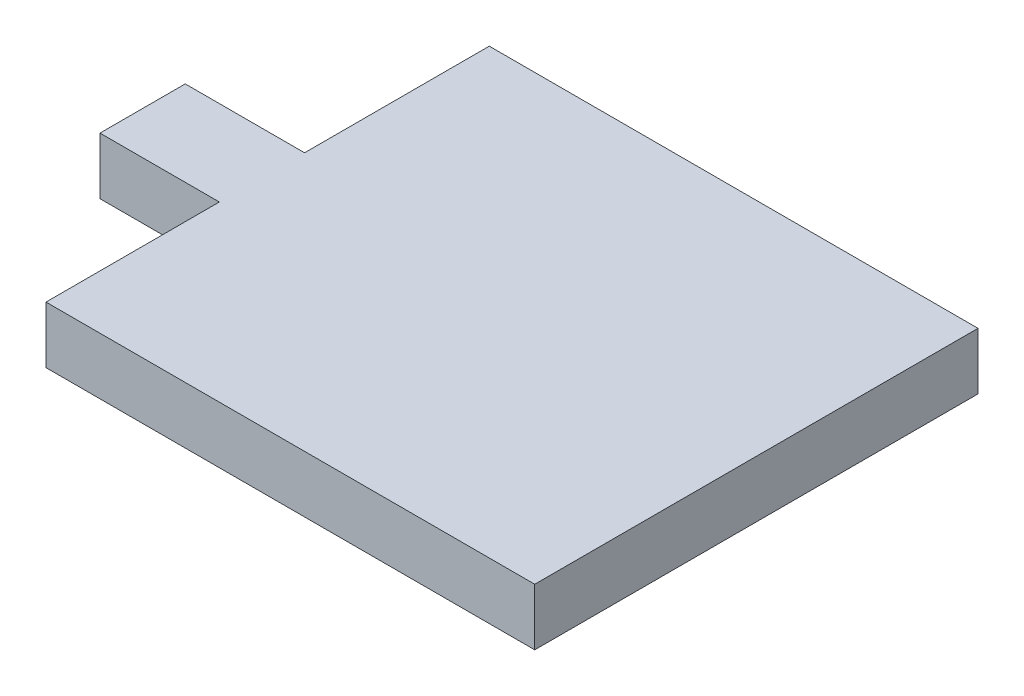
ISO-10303-21;
HEADER;
FILE_DESCRIPTION(('STEP AP214'),'2;1');
FILE_NAME('part.step','',(''),(''),'','','');
FILE_SCHEMA(('AUTOMOTIVE_DESIGN { 1 0 10303 214 1 1 1 1 }'));
ENDSEC;
DATA;
#1=APPLICATION_CONTEXT('core data for automotive mechanical design processes');
#2=APPLICATION_PROTOCOL_DEFINITION('international standard','automotive_design',2000,#1);
#3=PRODUCT_CONTEXT('',#1,'mechanical');
#4=PRODUCT('Part','Part','',(#3));
#5=PRODUCT_RELATED_PRODUCT_CATEGORY('part','',(#4));
#6=PRODUCT_DEFINITION_FORMATION('','',#4);
#7=PRODUCT_DEFINITION_CONTEXT('part definition',#1,'design');
#8=PRODUCT_DEFINITION('design','',#6,#7);
#9=PRODUCT_DEFINITION_SHAPE('','',#8);
#10=(LENGTH_UNIT() NAMED_UNIT(*) SI_UNIT(.MILLI.,.METRE.));
#11=(NAMED_UNIT(*) PLANE_ANGLE_UNIT() SI_UNIT($,.RADIAN.));
#12=(NAMED_UNIT(*) SI_UNIT($,.STERADIAN.) SOLID_ANGLE_UNIT());
#13=UNCERTAINTY_MEASURE_WITH_UNIT(LENGTH_MEASURE(1.E-05),#10,'distance_accuracy_value','');
#14=(GEOMETRIC_REPRESENTATION_CONTEXT(3) GLOBAL_UNCERTAINTY_ASSIGNED_CONTEXT((#13)) GLOBAL_UNIT_ASSIGNED_CONTEXT((#10,
#11,#12)) REPRESENTATION_CONTEXT('',''));
#15=CARTESIAN_POINT('',(0.,0.,0.));
#16=DIRECTION('',(0.,0.,1.));
#17=DIRECTION('',(1.,0.,0.));
#18=AXIS2_PLACEMENT_3D('',#15,#16,#17);
#19=CARTESIAN_POINT('',(0.,5.,0.));
#20=DIRECTION('',(1.,0.,0.));
#21=DIRECTION('',(0.,0.,-1.));
#22=AXIS2_PLACEMENT_3D('',#19,#20,#21);
#23=PLANE('',#22);
#24=DIRECTION('',(0.,0.,1.));
#25=VECTOR('',#24,1.);
#26=CARTESIAN_POINT('',(0.,0.,0.));
#27=LINE('',#26,#25);
#28=CARTESIAN_POINT('',(0.,0.,-15.25));
#29=VERTEX_POINT('',#28);
#30=CARTESIAN_POINT('',(0.,0.,0.));
#31=VERTEX_POINT('',#30);
#32=EDGE_CURVE('E158',#29,#31,#27,.T.);
#33=ORIENTED_EDGE('',*,*,#32,.T.);
#34=DIRECTION('',(0.,-1.,0.));
#35=VECTOR('',#34,1.);
#36=CARTESIAN_POINT('',(0.,5.,0.));
#37=LINE('',#36,#35);
#38=CARTESIAN_POINT('',(0.,5.,0.));
#39=VERTEX_POINT('',#38);
#40=EDGE_CURVE('E11',#39,#31,#37,.T.);
#41=ORIENTED_EDGE('',*,*,#40,.F.);
#42=DIRECTION('',(0.,0.,1.));
#43=VECTOR('',#42,1.);
#44=CARTESIAN_POINT('',(0.,5.,0.));
#45=LINE('',#44,#43);
#46=CARTESIAN_POINT('',(0.,5.,-15.25));
#47=VERTEX_POINT('',#46);
#48=EDGE_CURVE('E182',#47,#39,#45,.T.);
#49=ORIENTED_EDGE('',*,*,#48,.F.);
#50=DIRECTION('',(0.,-1.,0.));
#51=VECTOR('',#50,1.);
#52=CARTESIAN_POINT('',(0.,5.,-15.25));
#53=LINE('',#52,#51);
#54=EDGE_CURVE('E154',#47,#29,#53,.T.);
#55=ORIENTED_EDGE('',*,*,#54,.T.);
#56=EDGE_LOOP('',(#33,#41,#49,#55));
#57=FACE_BOUND('',#56,.T.);
#58=ADVANCED_FACE('F45',(#57),#23,.F.);
#59=CARTESIAN_POINT('',(0.,5.,0.));
#60=DIRECTION('',(0.,0.,-1.));
#61=DIRECTION('',(-1.,0.,0.));
#62=AXIS2_PLACEMENT_3D('',#59,#60,#61);
#63=PLANE('',#62);
#64=DIRECTION('',(1.,0.,0.));
#65=VECTOR('',#64,1.);
#66=CARTESIAN_POINT('',(0.,0.,0.));
#67=LINE('',#66,#65);
#68=CARTESIAN_POINT('',(43.,0.,0.));
#69=VERTEX_POINT('',#68);
#70=EDGE_CURVE('E162',#31,#69,#67,.T.);
#71=ORIENTED_EDGE('',*,*,#70,.T.);
#72=DIRECTION('',(0.,-1.,0.));
#73=VECTOR('',#72,1.);
#74=CARTESIAN_POINT('',(43.,5.,0.));
#75=LINE('',#74,#73);
#76=CARTESIAN_POINT('',(43.,5.,0.));
#77=VERTEX_POINT('',#76);
#78=EDGE_CURVE('E53',#77,#69,#75,.T.);
#79=ORIENTED_EDGE('',*,*,#78,.F.);
#80=DIRECTION('',(1.,0.,0.));
#81=VECTOR('',#80,1.);
#82=CARTESIAN_POINT('',(0.,5.,0.));
#83=LINE('',#82,#81);
#84=EDGE_CURVE('E110',#39,#77,#83,.T.);
#85=ORIENTED_EDGE('',*,*,#84,.F.);
#86=ORIENTED_EDGE('',*,*,#40,.T.);
#87=EDGE_LOOP('',(#71,#79,#85,#86));
#88=FACE_BOUND('',#87,.T.);
#89=ADVANCED_FACE('F308',(#88),#63,.F.);
#90=CARTESIAN_POINT('',(43.,5.,0.));
#91=DIRECTION('',(-1.,0.,0.));
#92=DIRECTION('',(0.,0.,1.));
#93=AXIS2_PLACEMENT_3D('',#90,#91,#92);
#94=PLANE('',#93);
#95=DIRECTION('',(0.,0.,-1.));
#96=VECTOR('',#95,1.);
#97=CARTESIAN_POINT('',(43.,0.,0.));
#98=LINE('',#97,#96);
#99=CARTESIAN_POINT('',(43.,0.,-39.));
#100=VERTEX_POINT('',#99);
#101=EDGE_CURVE('E166',#69,#100,#98,.T.);
#102=ORIENTED_EDGE('',*,*,#101,.T.);
#103=DIRECTION('',(0.,-1.,0.));
#104=VECTOR('',#103,1.);
#105=CARTESIAN_POINT('',(43.,5.,-39.));
#106=LINE('',#105,#104);
#107=CARTESIAN_POINT('',(43.,5.,-39.));
#108=VERTEX_POINT('',#107);
#109=EDGE_CURVE('E193',#108,#100,#106,.T.);
#110=ORIENTED_EDGE('',*,*,#109,.F.);
#111=DIRECTION('',(0.,0.,-1.));
#112=VECTOR('',#111,1.);
#113=CARTESIAN_POINT('',(43.,5.,0.));
#114=LINE('',#113,#112);
#115=EDGE_CURVE('E203',#77,#108,#114,.T.);
#116=ORIENTED_EDGE('',*,*,#115,.F.);
#117=ORIENTED_EDGE('',*,*,#78,.T.);
#118=EDGE_LOOP('',(#102,#110,#116,#117));
#119=FACE_BOUND('',#118,.T.);
#120=ADVANCED_FACE('F201',(#119),#94,.F.);
#121=CARTESIAN_POINT('',(0.,5.,-39.));
#122=DIRECTION('',(0.,0.,1.));
#123=DIRECTION('',(1.,0.,0.));
#124=AXIS2_PLACEMENT_3D('',#121,#122,#123);
#125=PLANE('',#124);
#126=DIRECTION('',(-1.,0.,0.));
#127=VECTOR('',#126,1.);
#128=CARTESIAN_POINT('',(0.,0.,-39.));
#129=LINE('',#128,#127);
#130=CARTESIAN_POINT('',(0.,0.,-39.));
#131=VERTEX_POINT('',#130);
#132=EDGE_CURVE('E169',#100,#131,#129,.T.);
#133=ORIENTED_EDGE('',*,*,#132,.T.);
#134=DIRECTION('',(0.,-1.,0.));
#135=VECTOR('',#134,1.);
#136=CARTESIAN_POINT('',(0.,5.,-39.));
#137=LINE('',#136,#135);
#138=CARTESIAN_POINT('',(0.,5.,-39.));
#139=VERTEX_POINT('',#138);
#140=EDGE_CURVE('E189',#139,#131,#137,.T.);
#141=ORIENTED_EDGE('',*,*,#140,.F.);
#142=DIRECTION('',(-1.,0.,0.));
#143=VECTOR('',#142,1.);
#144=CARTESIAN_POINT('',(0.,5.,-39.));
#145=LINE('',#144,#143);
#146=EDGE_CURVE('E216',#108,#139,#145,.T.);
#147=ORIENTED_EDGE('',*,*,#146,.F.);
#148=ORIENTED_EDGE('',*,*,#109,.T.);
#149=EDGE_LOOP('',(#133,#141,#147,#148));
#150=FACE_BOUND('',#149,.T.);
#151=ADVANCED_FACE('F211',(#150),#125,.F.);
#152=CARTESIAN_POINT('',(0.,5.,-22.75));
#153=DIRECTION('',(1.,0.,0.));
#154=DIRECTION('',(0.,0.,-1.));
#155=AXIS2_PLACEMENT_3D('',#152,#153,#154);
#156=PLANE('',#155);
#157=DIRECTION('',(0.,0.,1.));
#158=VECTOR('',#157,1.);
#159=CARTESIAN_POINT('',(0.,0.,-22.75));
#160=LINE('',#159,#158);
#161=CARTESIAN_POINT('',(0.,0.,-22.75));
#162=VERTEX_POINT('',#161);
#163=EDGE_CURVE('E172',#131,#162,#160,.T.);
#164=ORIENTED_EDGE('',*,*,#163,.T.);
#165=DIRECTION('',(0.,-1.,0.));
#166=VECTOR('',#165,1.);
#167=CARTESIAN_POINT('',(0.,5.,-22.75));
#168=LINE('',#167,#166);
#169=CARTESIAN_POINT('',(0.,5.,-22.75));
#170=VERTEX_POINT('',#169);
#171=EDGE_CURVE('E147',#170,#162,#168,.T.);
#172=ORIENTED_EDGE('',*,*,#171,.F.);
#173=DIRECTION('',(0.,0.,1.));
#174=VECTOR('',#173,1.);
#175=CARTESIAN_POINT('',(0.,5.,-22.75));
#176=LINE('',#175,#174);
#177=EDGE_CURVE('E133',#139,#170,#176,.T.);
#178=ORIENTED_EDGE('',*,*,#177,.F.);
#179=ORIENTED_EDGE('',*,*,#140,.T.);
#180=EDGE_LOOP('',(#164,#172,#178,#179));
#181=FACE_BOUND('',#180,.T.);
#182=ADVANCED_FACE('F214',(#181),#156,.F.);
#183=CARTESIAN_POINT('',(0.,5.,-22.75));
#184=DIRECTION('',(0.,0.,1.));
#185=DIRECTION('',(1.,0.,0.));
#186=AXIS2_PLACEMENT_3D('',#183,#184,#185);
#187=PLANE('',#186);
#188=DIRECTION('',(-1.,0.,0.));
#189=VECTOR('',#188,1.);
#190=CARTESIAN_POINT('',(0.,0.,-22.75));
#191=LINE('',#190,#189);
#192=CARTESIAN_POINT('',(-10.5,0.,-22.75));
#193=VERTEX_POINT('',#192);
#194=EDGE_CURVE('E143',#162,#193,#191,.T.);
#195=ORIENTED_EDGE('',*,*,#194,.T.);
#196=DIRECTION('',(0.,-1.,0.));
#197=VECTOR('',#196,1.);
#198=CARTESIAN_POINT('',(-10.5,5.,-22.75));
#199=LINE('',#198,#197);
#200=CARTESIAN_POINT('',(-10.5,5.,-22.75));
#201=VERTEX_POINT('',#200);
#202=EDGE_CURVE('E140',#201,#193,#199,.T.);
#203=ORIENTED_EDGE('',*,*,#202,.F.);
#204=DIRECTION('',(-1.,0.,0.));
#205=VECTOR('',#204,1.);
#206=CARTESIAN_POINT('',(0.,5.,-22.75));
#207=LINE('',#206,#205);
#208=EDGE_CURVE('E126',#170,#201,#207,.T.);
#209=ORIENTED_EDGE('',*,*,#208,.F.);
#210=ORIENTED_EDGE('',*,*,#171,.T.);
#211=EDGE_LOOP('',(#195,#203,#209,#210));
#212=FACE_BOUND('',#211,.T.);
#213=ADVANCED_FACE('F141',(#212),#187,.F.);
#214=CARTESIAN_POINT('',(-10.5,5.,-22.75));
#215=DIRECTION('',(1.,0.,0.));
#216=DIRECTION('',(0.,0.,-1.));
#217=AXIS2_PLACEMENT_3D('',#214,#215,#216);
#218=PLANE('',#217);
#219=DIRECTION('',(0.,0.,1.));
#220=VECTOR('',#219,1.);
#221=CARTESIAN_POINT('',(-10.5,1.5,-21.5));
#222=LINE('',#221,#220);
#223=CARTESIAN_POINT('',(-10.5,1.5,-21.5));
#224=VERTEX_POINT('',#223);
#225=CARTESIAN_POINT('',(-10.5,1.5,-16.5));
#226=VERTEX_POINT('',#225);
#227=EDGE_CURVE('E249',#224,#226,#222,.T.);
#228=ORIENTED_EDGE('',*,*,#227,.F.);
#229=DIRECTION('',(0.,-1.,0.));
#230=VECTOR('',#229,1.);
#231=CARTESIAN_POINT('',(-10.5,3.5,-21.5));
#232=LINE('',#231,#230);
#233=CARTESIAN_POINT('',(-10.5,3.5,-21.5));
#234=VERTEX_POINT('',#233);
#235=EDGE_CURVE('E60',#234,#224,#232,.T.);
#236=ORIENTED_EDGE('',*,*,#235,.F.);
#237=DIRECTION('',(0.,0.,-1.));
#238=VECTOR('',#237,1.);
#239=CARTESIAN_POINT('',(-10.5,3.5,-21.5));
#240=LINE('',#239,#238);
#241=CARTESIAN_POINT('',(-10.5,3.5,-16.5));
#242=VERTEX_POINT('',#241);
#243=EDGE_CURVE('E240',#242,#234,#240,.T.);
#244=ORIENTED_EDGE('',*,*,#243,.F.);
#245=DIRECTION('',(0.,1.,0.));
#246=VECTOR('',#245,1.);
#247=CARTESIAN_POINT('',(-10.5,3.5,-16.5));
#248=LINE('',#247,#246);
#249=EDGE_CURVE('E245',#226,#242,#248,.T.);
#250=ORIENTED_EDGE('',*,*,#249,.F.);
#251=EDGE_LOOP('',(#228,#236,#244,#250));
#252=FACE_BOUND('',#251,.T.);
#253=DIRECTION('',(0.,0.,1.));
#254=VECTOR('',#253,1.);
#255=CARTESIAN_POINT('',(-10.5,0.,-22.75));
#256=LINE('',#255,#254);
#257=CARTESIAN_POINT('',(-10.5,0.,-15.25));
#258=VERTEX_POINT('',#257);
#259=EDGE_CURVE('E177',#193,#258,#256,.T.);
#260=ORIENTED_EDGE('',*,*,#259,.T.);
#261=DIRECTION('',(0.,-1.,0.));
#262=VECTOR('',#261,1.);
#263=CARTESIAN_POINT('',(-10.5,5.,-15.25));
#264=LINE('',#263,#262);
#265=CARTESIAN_POINT('',(-10.5,5.,-15.25));
#266=VERTEX_POINT('',#265);
#267=EDGE_CURVE('E148',#266,#258,#264,.T.);
#268=ORIENTED_EDGE('',*,*,#267,.F.);
#269=DIRECTION('',(0.,0.,1.));
#270=VECTOR('',#269,1.);
#271=CARTESIAN_POINT('',(-10.5,5.,-22.75));
#272=LINE('',#271,#270);
#273=EDGE_CURVE('E130',#201,#266,#272,.T.);
#274=ORIENTED_EDGE('',*,*,#273,.F.);
#275=ORIENTED_EDGE('',*,*,#202,.T.);
#276=EDGE_LOOP('',(#260,#268,#274,#275));
#277=FACE_BOUND('',#276,.T.);
#278=ADVANCED_FACE('F150',(#252,#277),#218,.F.);
#279=CARTESIAN_POINT('',(-10.5,5.,-15.25));
#280=DIRECTION('',(0.,0.,-1.));
#281=DIRECTION('',(-1.,0.,0.));
#282=AXIS2_PLACEMENT_3D('',#279,#280,#281);
#283=PLANE('',#282);
#284=DIRECTION('',(1.,0.,0.));
#285=VECTOR('',#284,1.);
#286=CARTESIAN_POINT('',(-10.5,0.,-15.25));
#287=LINE('',#286,#285);
#288=EDGE_CURVE('E102',#258,#29,#287,.T.);
#289=ORIENTED_EDGE('',*,*,#288,.T.);
#290=ORIENTED_EDGE('',*,*,#54,.F.);
#291=DIRECTION('',(1.,0.,0.));
#292=VECTOR('',#291,1.);
#293=CARTESIAN_POINT('',(-10.5,5.,-15.25));
#294=LINE('',#293,#292);
#295=EDGE_CURVE('E69',#266,#47,#294,.T.);
#296=ORIENTED_EDGE('',*,*,#295,.F.);
#297=ORIENTED_EDGE('',*,*,#267,.T.);
#298=EDGE_LOOP('',(#289,#290,#296,#297));
#299=FACE_BOUND('',#298,.T.);
#300=ADVANCED_FACE('F315',(#299),#283,.F.);
#301=CARTESIAN_POINT('',(0.,5.,0.));
#302=DIRECTION('',(0.,-1.,0.));
#303=DIRECTION('',(0.,0.,-1.));
#304=AXIS2_PLACEMENT_3D('',#301,#302,#303);
#305=PLANE('',#304);
#306=ORIENTED_EDGE('',*,*,#48,.T.);
#307=ORIENTED_EDGE('',*,*,#84,.T.);
#308=ORIENTED_EDGE('',*,*,#115,.T.);
#309=ORIENTED_EDGE('',*,*,#146,.T.);
#310=ORIENTED_EDGE('',*,*,#177,.T.);
#311=ORIENTED_EDGE('',*,*,#208,.T.);
#312=ORIENTED_EDGE('',*,*,#273,.T.);
#313=ORIENTED_EDGE('',*,*,#295,.T.);
#314=EDGE_LOOP('',(#306,#307,#308,#309,#310,#311,#312,#313));
#315=FACE_BOUND('',#314,.T.);
#316=ADVANCED_FACE('F128',(#315),#305,.F.);
#317=CARTESIAN_POINT('',(0.,0.,0.));
#318=DIRECTION('',(0.,-1.,0.));
#319=DIRECTION('',(0.,0.,-1.));
#320=AXIS2_PLACEMENT_3D('',#317,#318,#319);
#321=PLANE('',#320);
#322=ORIENTED_EDGE('',*,*,#32,.F.);
#323=ORIENTED_EDGE('',*,*,#288,.F.);
#324=ORIENTED_EDGE('',*,*,#259,.F.);
#325=ORIENTED_EDGE('',*,*,#194,.F.);
#326=ORIENTED_EDGE('',*,*,#163,.F.);
#327=ORIENTED_EDGE('',*,*,#132,.F.);
#328=ORIENTED_EDGE('',*,*,#101,.F.);
#329=ORIENTED_EDGE('',*,*,#70,.F.);
#330=EDGE_LOOP('',(#322,#323,#324,#325,#326,#327,#328,#329));
#331=FACE_BOUND('',#330,.T.);
#332=ADVANCED_FACE('F207',(#331),#321,.T.);
#333=CARTESIAN_POINT('',(3.50000000000001,3.5,-21.5));
#334=DIRECTION('',(0.,0.,-1.));
#335=DIRECTION('',(-1.,0.,0.));
#336=AXIS2_PLACEMENT_3D('',#333,#334,#335);
#337=PLANE('',#336);
#338=ORIENTED_EDGE('',*,*,#235,.T.);
#339=DIRECTION('',(-1.,0.,0.));
#340=VECTOR('',#339,1.);
#341=CARTESIAN_POINT('',(3.50000000000001,1.5,-21.5));
#342=LINE('',#341,#340);
#343=CARTESIAN_POINT('',(3.50000000000001,1.5,-21.5));
#344=VERTEX_POINT('',#343);
#345=EDGE_CURVE('E226',#344,#224,#342,.T.);
#346=ORIENTED_EDGE('',*,*,#345,.F.);
#347=DIRECTION('',(0.,-1.,0.));
#348=VECTOR('',#347,1.);
#349=CARTESIAN_POINT('',(3.50000000000001,3.5,-21.5));
#350=LINE('',#349,#348);
#351=CARTESIAN_POINT('',(3.50000000000001,3.5,-21.5));
#352=VERTEX_POINT('',#351);
#353=EDGE_CURVE('E244',#352,#344,#350,.T.);
#354=ORIENTED_EDGE('',*,*,#353,.F.);
#355=DIRECTION('',(-1.,0.,0.));
#356=VECTOR('',#355,1.);
#357=CARTESIAN_POINT('',(3.50000000000001,3.5,-21.5));
#358=LINE('',#357,#356);
#359=EDGE_CURVE('E163',#352,#234,#358,.T.);
#360=ORIENTED_EDGE('',*,*,#359,.T.);
#361=EDGE_LOOP('',(#338,#346,#354,#360));
#362=FACE_BOUND('',#361,.T.);
#363=ADVANCED_FACE('F276',(#362),#337,.F.);
#364=CARTESIAN_POINT('',(3.50000000000001,3.5,-21.5));
#365=DIRECTION('',(0.,1.,0.));
#366=DIRECTION('',(0.,0.,1.));
#367=AXIS2_PLACEMENT_3D('',#364,#365,#366);
#368=PLANE('',#367);
#369=ORIENTED_EDGE('',*,*,#243,.T.);
#370=ORIENTED_EDGE('',*,*,#359,.F.);
#371=DIRECTION('',(0.,0.,-1.));
#372=VECTOR('',#371,1.);
#373=CARTESIAN_POINT('',(3.50000000000001,3.5,-21.5));
#374=LINE('',#373,#372);
#375=CARTESIAN_POINT('',(3.50000000000001,3.5,-16.5));
#376=VERTEX_POINT('',#375);
#377=EDGE_CURVE('E230',#376,#352,#374,.T.);
#378=ORIENTED_EDGE('',*,*,#377,.F.);
#379=DIRECTION('',(-1.,0.,0.));
#380=VECTOR('',#379,1.);
#381=CARTESIAN_POINT('',(3.50000000000001,3.5,-16.5));
#382=LINE('',#381,#380);
#383=EDGE_CURVE('E234',#376,#242,#382,.T.);
#384=ORIENTED_EDGE('',*,*,#383,.T.);
#385=EDGE_LOOP('',(#369,#370,#378,#384));
#386=FACE_BOUND('',#385,.T.);
#387=ADVANCED_FACE('F287',(#386),#368,.F.);
#388=CARTESIAN_POINT('',(3.50000000000001,3.5,-16.5));
#389=DIRECTION('',(0.,0.,1.));
#390=DIRECTION('',(1.,0.,0.));
#391=AXIS2_PLACEMENT_3D('',#388,#389,#390);
#392=PLANE('',#391);
#393=ORIENTED_EDGE('',*,*,#249,.T.);
#394=ORIENTED_EDGE('',*,*,#383,.F.);
#395=DIRECTION('',(0.,1.,0.));
#396=VECTOR('',#395,1.);
#397=CARTESIAN_POINT('',(3.50000000000001,3.5,-16.5));
#398=LINE('',#397,#396);
#399=CARTESIAN_POINT('',(3.50000000000001,1.5,-16.5));
#400=VERTEX_POINT('',#399);
#401=EDGE_CURVE('E258',#400,#376,#398,.T.);
#402=ORIENTED_EDGE('',*,*,#401,.F.);
#403=DIRECTION('',(-1.,0.,0.));
#404=VECTOR('',#403,1.);
#405=CARTESIAN_POINT('',(3.50000000000001,1.5,-16.5));
#406=LINE('',#405,#404);
#407=EDGE_CURVE('E229',#400,#226,#406,.T.);
#408=ORIENTED_EDGE('',*,*,#407,.T.);
#409=EDGE_LOOP('',(#393,#394,#402,#408));
#410=FACE_BOUND('',#409,.T.);
#411=ADVANCED_FACE('F292',(#410),#392,.F.);
#412=CARTESIAN_POINT('',(3.50000000000001,1.5,-21.5));
#413=DIRECTION('',(0.,-1.,0.));
#414=DIRECTION('',(0.,0.,-1.));
#415=AXIS2_PLACEMENT_3D('',#412,#413,#414);
#416=PLANE('',#415);
#417=ORIENTED_EDGE('',*,*,#227,.T.);
#418=ORIENTED_EDGE('',*,*,#407,.F.);
#419=DIRECTION('',(0.,0.,1.));
#420=VECTOR('',#419,1.);
#421=CARTESIAN_POINT('',(3.50000000000001,1.5,-21.5));
#422=LINE('',#421,#420);
#423=EDGE_CURVE('E262',#344,#400,#422,.T.);
#424=ORIENTED_EDGE('',*,*,#423,.F.);
#425=ORIENTED_EDGE('',*,*,#345,.T.);
#426=EDGE_LOOP('',(#417,#418,#424,#425));
#427=FACE_BOUND('',#426,.T.);
#428=ADVANCED_FACE('F297',(#427),#416,.F.);
#429=CARTESIAN_POINT('',(3.5,0.,0.));
#430=DIRECTION('',(-1.,0.,0.));
#431=DIRECTION('',(0.,0.,1.));
#432=AXIS2_PLACEMENT_3D('',#429,#430,#431);
#433=PLANE('',#432);
#434=ORIENTED_EDGE('',*,*,#353,.T.);
#435=ORIENTED_EDGE('',*,*,#423,.T.);
#436=ORIENTED_EDGE('',*,*,#401,.T.);
#437=ORIENTED_EDGE('',*,*,#377,.T.);
#438=EDGE_LOOP('',(#434,#435,#436,#437));
#439=FACE_BOUND('',#438,.T.);
#440=ADVANCED_FACE('F271',(#439),#433,.T.);
#441=CLOSED_SHELL('',(#58,#89,#120,#151,#182,#213,#278,#300,#316,#332,#363,#387,#411,#428,#440));
#442=MANIFOLD_SOLID_BREP('B2',#441);
#443=ADVANCED_BREP_SHAPE_REPRESENTATION('',(#18,#442),#14);
#444=SHAPE_DEFINITION_REPRESENTATION(#9,#443);
ENDSEC;
END-ISO-10303-21;
